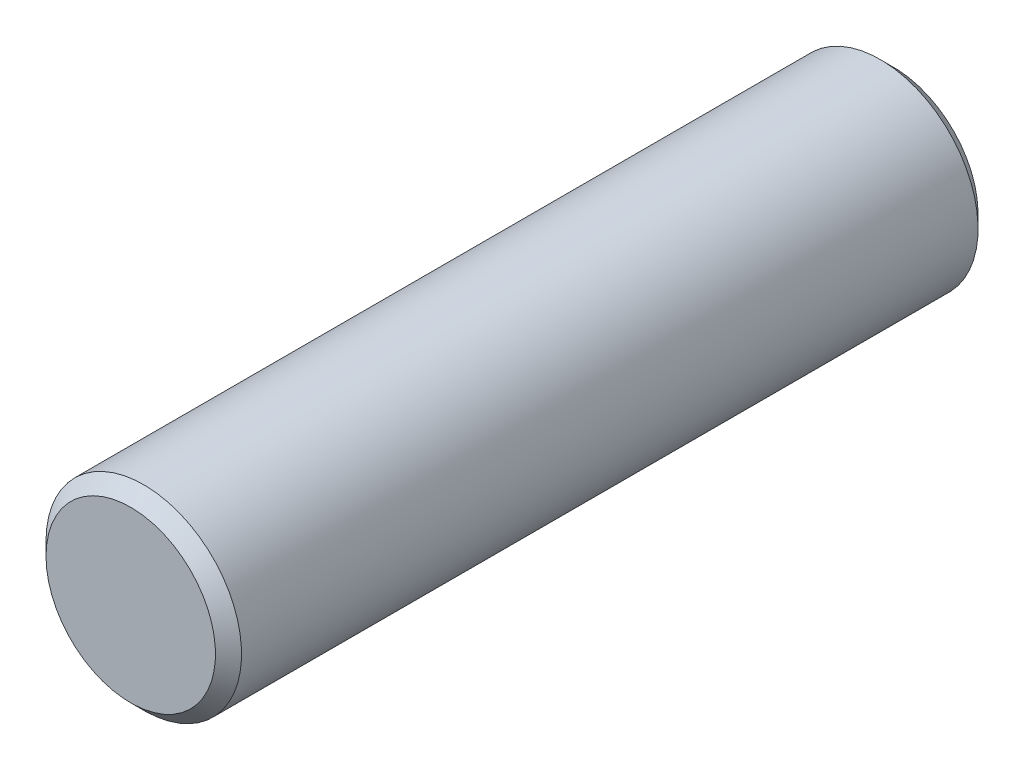
ISO-10303-21;
HEADER;
FILE_DESCRIPTION(('STEP AP214'),'2;1');
FILE_NAME('part.step','',(''),(''),'','','');
FILE_SCHEMA(('AUTOMOTIVE_DESIGN { 1 0 10303 214 1 1 1 1 }'));
ENDSEC;
DATA;
#1=APPLICATION_CONTEXT('core data for automotive mechanical design processes');
#2=APPLICATION_PROTOCOL_DEFINITION('international standard','automotive_design',2000,#1);
#3=PRODUCT_CONTEXT('',#1,'mechanical');
#4=PRODUCT('Part','Part','',(#3));
#5=PRODUCT_RELATED_PRODUCT_CATEGORY('part','',(#4));
#6=PRODUCT_DEFINITION_FORMATION('','',#4);
#7=PRODUCT_DEFINITION_CONTEXT('part definition',#1,'design');
#8=PRODUCT_DEFINITION('design','',#6,#7);
#9=PRODUCT_DEFINITION_SHAPE('','',#8);
#10=(LENGTH_UNIT() NAMED_UNIT(*) SI_UNIT(.MILLI.,.METRE.));
#11=(NAMED_UNIT(*) PLANE_ANGLE_UNIT() SI_UNIT($,.RADIAN.));
#12=(NAMED_UNIT(*) SI_UNIT($,.STERADIAN.) SOLID_ANGLE_UNIT());
#13=UNCERTAINTY_MEASURE_WITH_UNIT(LENGTH_MEASURE(1.E-05),#10,'distance_accuracy_value','');
#14=(GEOMETRIC_REPRESENTATION_CONTEXT(3) GLOBAL_UNCERTAINTY_ASSIGNED_CONTEXT((#13)) GLOBAL_UNIT_ASSIGNED_CONTEXT((#10,
#11,#12)) REPRESENTATION_CONTEXT('',''));
#15=CARTESIAN_POINT('',(0.,0.,0.));
#16=DIRECTION('',(0.,0.,1.));
#17=DIRECTION('',(1.,0.,0.));
#18=AXIS2_PLACEMENT_3D('',#15,#16,#17);
#19=CARTESIAN_POINT('',(0.,0.,11.7));
#20=DIRECTION('',(0.,0.,1.));
#21=DIRECTION('',(1.,0.,0.));
#22=AXIS2_PLACEMENT_3D('',#19,#20,#21);
#23=PLANE('',#22);
#24=CARTESIAN_POINT('',(0.,0.,11.7000000000189));
#25=DIRECTION('',(0.,0.,-1.));
#26=DIRECTION('',(-1.,0.,0.));
#27=AXIS2_PLACEMENT_3D('',#24,#25,#26);
#28=CIRCLE('',#27,1.30000000001473);
#29=CARTESIAN_POINT('',(-1.30000000001473,0.,11.7000000000189));
#30=VERTEX_POINT('',#29);
#31=EDGE_CURVE('E19',#30,#30,#28,.T.);
#32=ORIENTED_EDGE('',*,*,#31,.F.);
#33=EDGE_LOOP('',(#32));
#34=FACE_BOUND('',#33,.T.);
#35=ADVANCED_FACE('F16',(#34),#23,.T.);
#36=CARTESIAN_POINT('',(0.,0.,0.));
#37=DIRECTION('',(0.,0.,1.));
#38=DIRECTION('',(1.,0.,0.));
#39=AXIS2_PLACEMENT_3D('',#36,#37,#38);
#40=PLANE('',#39);
#41=CARTESIAN_POINT('',(0.,0.,0.));
#42=DIRECTION('',(0.,0.,1.));
#43=DIRECTION('',(0.,-1.,0.));
#44=AXIS2_PLACEMENT_3D('',#41,#42,#43);
#45=CIRCLE('',#44,1.29999999995789);
#46=CARTESIAN_POINT('',(0.,-1.29999999995789,0.));
#47=VERTEX_POINT('',#46);
#48=EDGE_CURVE('E28',#47,#47,#45,.T.);
#49=ORIENTED_EDGE('',*,*,#48,.F.);
#50=EDGE_LOOP('',(#49));
#51=FACE_BOUND('',#50,.T.);
#52=ADVANCED_FACE('F39',(#51),#40,.F.);
#53=CARTESIAN_POINT('',(0.,0.,11.500000000126));
#54=DIRECTION('',(0.,0.,-1.));
#55=DIRECTION('',(-1.,0.,0.));
#56=AXIS2_PLACEMENT_3D('',#53,#54,#55);
#57=CONICAL_SURFACE('',#56,1.49999999990769,0.785398163397448);
#58=CARTESIAN_POINT('',(0.,0.,11.5));
#59=DIRECTION('',(0.,0.,-1.));
#60=DIRECTION('',(-1.,0.,0.));
#61=AXIS2_PLACEMENT_3D('',#58,#59,#60);
#62=CIRCLE('',#61,1.5);
#63=CARTESIAN_POINT('',(-1.5,0.,11.5));
#64=VERTEX_POINT('',#63);
#65=EDGE_CURVE('E23',#64,#64,#62,.T.);
#66=ORIENTED_EDGE('',*,*,#65,.F.);
#67=EDGE_LOOP('',(#66));
#68=FACE_BOUND('',#67,.T.);
#69=ORIENTED_EDGE('',*,*,#31,.T.);
#70=EDGE_LOOP('',(#69));
#71=FACE_BOUND('',#70,.T.);
#72=ADVANCED_FACE('F36',(#68,#71),#57,.T.);
#73=CARTESIAN_POINT('',(0.,0.,0.199999999949796));
#74=DIRECTION('',(0.,0.,1.));
#75=DIRECTION('',(0.,-1.,0.));
#76=AXIS2_PLACEMENT_3D('',#73,#74,#75);
#77=CONICAL_SURFACE('',#76,1.49999999990769,0.785398163397448);
#78=CARTESIAN_POINT('',(0.,0.,0.200000000000006));
#79=DIRECTION('',(0.,0.,-1.));
#80=DIRECTION('',(-1.,0.,0.));
#81=AXIS2_PLACEMENT_3D('',#78,#79,#80);
#82=CIRCLE('',#81,1.5);
#83=CARTESIAN_POINT('',(-1.5,0.,0.200000000000006));
#84=VERTEX_POINT('',#83);
#85=EDGE_CURVE('E10',#84,#84,#82,.F.);
#86=ORIENTED_EDGE('',*,*,#85,.F.);
#87=EDGE_LOOP('',(#86));
#88=FACE_BOUND('',#87,.T.);
#89=ORIENTED_EDGE('',*,*,#48,.T.);
#90=EDGE_LOOP('',(#89));
#91=FACE_BOUND('',#90,.T.);
#92=ADVANCED_FACE('F46',(#88,#91),#77,.T.);
#93=CARTESIAN_POINT('',(0.,0.,11.7));
#94=DIRECTION('',(0.,0.,-1.));
#95=DIRECTION('',(-1.,0.,0.));
#96=AXIS2_PLACEMENT_3D('',#93,#94,#95);
#97=CYLINDRICAL_SURFACE('',#96,1.5);
#98=ORIENTED_EDGE('',*,*,#85,.T.);
#99=EDGE_LOOP('',(#98));
#100=FACE_BOUND('',#99,.T.);
#101=ORIENTED_EDGE('',*,*,#65,.T.);
#102=EDGE_LOOP('',(#101));
#103=FACE_BOUND('',#102,.T.);
#104=ADVANCED_FACE('F44',(#100,#103),#97,.T.);
#105=CLOSED_SHELL('',(#35,#52,#72,#92,#104));
#106=MANIFOLD_SOLID_BREP('B1',#105);
#107=ADVANCED_BREP_SHAPE_REPRESENTATION('',(#18,#106),#14);
#108=SHAPE_DEFINITION_REPRESENTATION(#9,#107);
ENDSEC;
END-ISO-10303-21;
